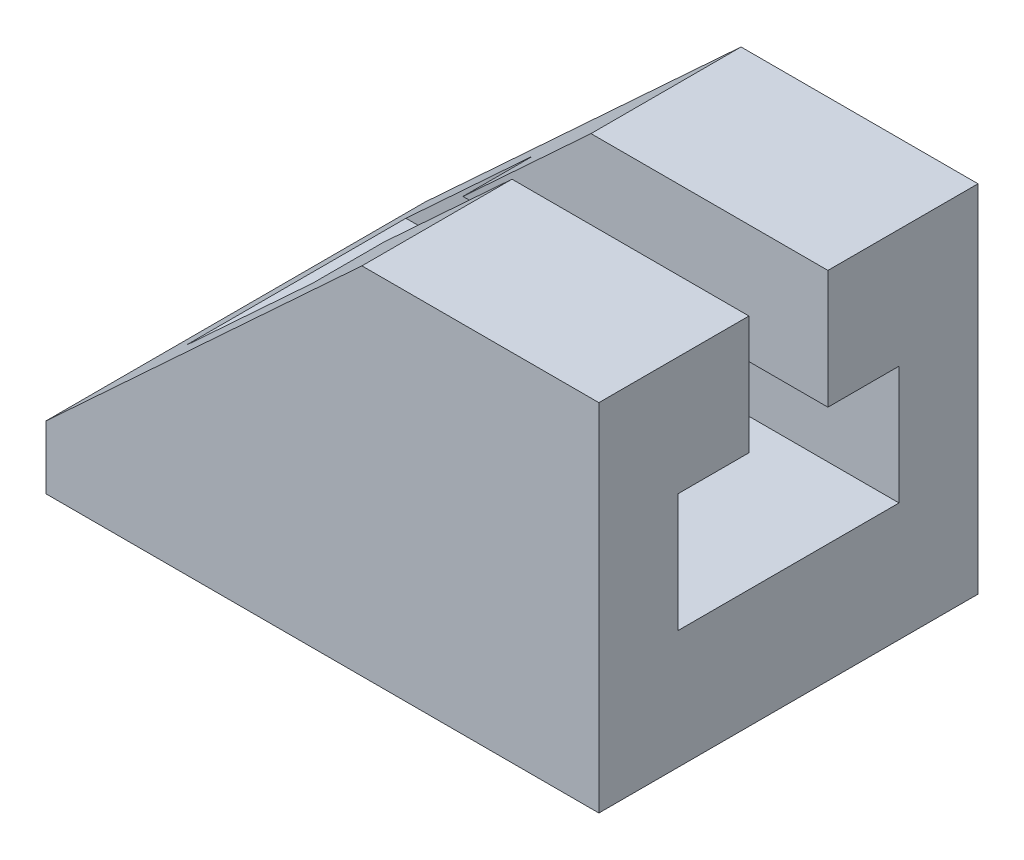
ISO-10303-21;
HEADER;
FILE_DESCRIPTION(('STEP AP214'),'2;1');
FILE_NAME('part.step','',(''),(''),'','','');
FILE_SCHEMA(('AUTOMOTIVE_DESIGN { 1 0 10303 214 1 1 1 1 }'));
ENDSEC;
DATA;
#1=APPLICATION_CONTEXT('core data for automotive mechanical design processes');
#2=APPLICATION_PROTOCOL_DEFINITION('international standard','automotive_design',2000,#1);
#3=PRODUCT_CONTEXT('',#1,'mechanical');
#4=PRODUCT('Part','Part','',(#3));
#5=PRODUCT_RELATED_PRODUCT_CATEGORY('part','',(#4));
#6=PRODUCT_DEFINITION_FORMATION('','',#4);
#7=PRODUCT_DEFINITION_CONTEXT('part definition',#1,'design');
#8=PRODUCT_DEFINITION('design','',#6,#7);
#9=PRODUCT_DEFINITION_SHAPE('','',#8);
#10=(LENGTH_UNIT() NAMED_UNIT(*) SI_UNIT(.MILLI.,.METRE.));
#11=(NAMED_UNIT(*) PLANE_ANGLE_UNIT() SI_UNIT($,.RADIAN.));
#12=(NAMED_UNIT(*) SI_UNIT($,.STERADIAN.) SOLID_ANGLE_UNIT());
#13=UNCERTAINTY_MEASURE_WITH_UNIT(LENGTH_MEASURE(1.E-05),#10,'distance_accuracy_value','');
#14=(GEOMETRIC_REPRESENTATION_CONTEXT(3) GLOBAL_UNCERTAINTY_ASSIGNED_CONTEXT((#13)) GLOBAL_UNIT_ASSIGNED_CONTEXT((#10,
#11,#12)) REPRESENTATION_CONTEXT('',''));
#15=CARTESIAN_POINT('',(0.,0.,0.));
#16=DIRECTION('',(0.,0.,1.));
#17=DIRECTION('',(1.,0.,0.));
#18=AXIS2_PLACEMENT_3D('',#15,#16,#17);
#19=CARTESIAN_POINT('',(-3.69265374531835,10.3057594756554,48.));
#20=DIRECTION('',(0.,-1.,0.));
#21=DIRECTION('',(0.,0.,-1.));
#22=AXIS2_PLACEMENT_3D('',#19,#20,#21);
#23=PLANE('',#22);
#24=DIRECTION('',(0.,0.,-1.));
#25=VECTOR('',#24,1.);
#26=CARTESIAN_POINT('',(-33.6926537453184,10.3057594756554,48.));
#27=LINE('',#26,#25);
#28=CARTESIAN_POINT('',(-33.6926537453184,10.3057594756554,19.));
#29=VERTEX_POINT('',#28);
#30=CARTESIAN_POINT('',(-33.6926537453184,10.3057594756554,0.));
#31=VERTEX_POINT('',#30);
#32=EDGE_CURVE('E158',#29,#31,#27,.T.);
#33=ORIENTED_EDGE('',*,*,#32,.F.);
#34=DIRECTION('',(-1.,0.,0.));
#35=VECTOR('',#34,1.);
#36=CARTESIAN_POINT('',(-3.69265374531835,10.3057594756554,19.));
#37=LINE('',#36,#35);
#38=CARTESIAN_POINT('',(-3.69265374531835,10.3057594756554,19.));
#39=VERTEX_POINT('',#38);
#40=EDGE_CURVE('E142',#39,#29,#37,.T.);
#41=ORIENTED_EDGE('',*,*,#40,.F.);
#42=DIRECTION('',(0.,0.,-1.));
#43=VECTOR('',#42,1.);
#44=CARTESIAN_POINT('',(-3.69265374531835,10.3057594756554,48.));
#45=LINE('',#44,#43);
#46=CARTESIAN_POINT('',(-3.69265374531835,10.3057594756554,0.));
#47=VERTEX_POINT('',#46);
#48=EDGE_CURVE('E125',#39,#47,#45,.T.);
#49=ORIENTED_EDGE('',*,*,#48,.T.);
#50=DIRECTION('',(-1.,0.,0.));
#51=VECTOR('',#50,1.);
#52=CARTESIAN_POINT('',(-3.69265374531835,10.3057594756554,0.));
#53=LINE('',#52,#51);
#54=EDGE_CURVE('E149',#47,#31,#53,.T.);
#55=ORIENTED_EDGE('',*,*,#54,.T.);
#56=EDGE_LOOP('',(#33,#41,#49,#55));
#57=FACE_BOUND('',#56,.T.);
#58=ADVANCED_FACE('F39',(#57),#23,.F.);
#59=CARTESIAN_POINT('',(-73.6926537453184,-34.6942405243446,48.));
#60=DIRECTION('',(1.,0.,0.));
#61=DIRECTION('',(0.,0.,-1.));
#62=AXIS2_PLACEMENT_3D('',#59,#60,#61);
#63=PLANE('',#62);
#64=DIRECTION('',(0.,-1.,0.));
#65=VECTOR('',#64,1.);
#66=CARTESIAN_POINT('',(-73.6926537453184,-34.6942405243446,0.));
#67=LINE('',#66,#65);
#68=CARTESIAN_POINT('',(-73.6926537453184,-26.6942405243446,0.));
#69=VERTEX_POINT('',#68);
#70=CARTESIAN_POINT('',(-73.6926537453184,-34.6942405243446,0.));
#71=VERTEX_POINT('',#70);
#72=EDGE_CURVE('E137',#69,#71,#67,.T.);
#73=ORIENTED_EDGE('',*,*,#72,.T.);
#74=DIRECTION('',(0.,0.,-1.));
#75=VECTOR('',#74,1.);
#76=CARTESIAN_POINT('',(-73.6926537453184,-34.6942405243446,48.));
#77=LINE('',#76,#75);
#78=CARTESIAN_POINT('',(-73.6926537453184,-34.6942405243446,48.));
#79=VERTEX_POINT('',#78);
#80=EDGE_CURVE('E163',#79,#71,#77,.T.);
#81=ORIENTED_EDGE('',*,*,#80,.F.);
#82=DIRECTION('',(0.,-1.,0.));
#83=VECTOR('',#82,1.);
#84=CARTESIAN_POINT('',(-73.6926537453184,-34.6942405243446,48.));
#85=LINE('',#84,#83);
#86=CARTESIAN_POINT('',(-73.6926537453184,-26.6942405243446,48.));
#87=VERTEX_POINT('',#86);
#88=EDGE_CURVE('E155',#87,#79,#85,.T.);
#89=ORIENTED_EDGE('',*,*,#88,.F.);
#90=DIRECTION('',(0.,0.,-1.));
#91=VECTOR('',#90,1.);
#92=CARTESIAN_POINT('',(-73.6926537453184,-26.6942405243446,48.));
#93=LINE('',#92,#91);
#94=EDGE_CURVE('E133',#87,#69,#93,.T.);
#95=ORIENTED_EDGE('',*,*,#94,.T.);
#96=EDGE_LOOP('',(#73,#81,#89,#95));
#97=FACE_BOUND('',#96,.T.);
#98=ADVANCED_FACE('F41',(#97),#63,.F.);
#99=CARTESIAN_POINT('',(-73.6926537453184,-34.6942405243446,48.));
#100=DIRECTION('',(0.,1.,0.));
#101=DIRECTION('',(0.,0.,1.));
#102=AXIS2_PLACEMENT_3D('',#99,#100,#101);
#103=PLANE('',#102);
#104=DIRECTION('',(1.,0.,0.));
#105=VECTOR('',#104,1.);
#106=CARTESIAN_POINT('',(-73.6926537453184,-34.6942405243446,0.));
#107=LINE('',#106,#105);
#108=CARTESIAN_POINT('',(-3.69265374531835,-34.6942405243446,0.));
#109=VERTEX_POINT('',#108);
#110=EDGE_CURVE('E141',#71,#109,#107,.T.);
#111=ORIENTED_EDGE('',*,*,#110,.T.);
#112=DIRECTION('',(0.,0.,-1.));
#113=VECTOR('',#112,1.);
#114=CARTESIAN_POINT('',(-3.69265374531835,-34.6942405243446,48.));
#115=LINE('',#114,#113);
#116=CARTESIAN_POINT('',(-3.69265374531835,-34.6942405243446,48.));
#117=VERTEX_POINT('',#116);
#118=EDGE_CURVE('E124',#117,#109,#115,.T.);
#119=ORIENTED_EDGE('',*,*,#118,.F.);
#120=DIRECTION('',(1.,0.,0.));
#121=VECTOR('',#120,1.);
#122=CARTESIAN_POINT('',(-73.6926537453184,-34.6942405243446,48.));
#123=LINE('',#122,#121);
#124=EDGE_CURVE('E96',#79,#117,#123,.T.);
#125=ORIENTED_EDGE('',*,*,#124,.F.);
#126=ORIENTED_EDGE('',*,*,#80,.T.);
#127=EDGE_LOOP('',(#111,#119,#125,#126));
#128=FACE_BOUND('',#127,.T.);
#129=ADVANCED_FACE('F234',(#128),#103,.F.);
#130=CARTESIAN_POINT('',(-3.69265374531835,-34.6942405243446,48.));
#131=DIRECTION('',(-1.,0.,0.));
#132=DIRECTION('',(0.,0.,1.));
#133=AXIS2_PLACEMENT_3D('',#130,#131,#132);
#134=PLANE('',#133);
#135=ORIENTED_EDGE('',*,*,#48,.F.);
#136=DIRECTION('',(0.,-1.,0.));
#137=VECTOR('',#136,1.);
#138=CARTESIAN_POINT('',(-3.69265374531835,10.3057594756554,19.));
#139=LINE('',#138,#137);
#140=CARTESIAN_POINT('',(-3.69265374531835,-4.69424052434457,19.));
#141=VERTEX_POINT('',#140);
#142=EDGE_CURVE('E250',#39,#141,#139,.T.);
#143=ORIENTED_EDGE('',*,*,#142,.T.);
#144=DIRECTION('',(0.,0.,-1.));
#145=VECTOR('',#144,1.);
#146=CARTESIAN_POINT('',(-3.69265374531835,-4.69424052434457,19.));
#147=LINE('',#146,#145);
#148=CARTESIAN_POINT('',(-3.69265374531835,-4.69424052434457,10.));
#149=VERTEX_POINT('',#148);
#150=EDGE_CURVE('E255',#141,#149,#147,.T.);
#151=ORIENTED_EDGE('',*,*,#150,.T.);
#152=DIRECTION('',(0.,-1.,0.));
#153=VECTOR('',#152,1.);
#154=CARTESIAN_POINT('',(-3.69265374531835,-4.69424052434457,10.));
#155=LINE('',#154,#153);
#156=CARTESIAN_POINT('',(-3.69265374531835,-19.6942405243446,10.));
#157=VERTEX_POINT('',#156);
#158=EDGE_CURVE('E258',#149,#157,#155,.T.);
#159=ORIENTED_EDGE('',*,*,#158,.T.);
#160=DIRECTION('',(0.,0.,1.));
#161=VECTOR('',#160,1.);
#162=CARTESIAN_POINT('',(-3.69265374531835,-19.6942405243446,10.));
#163=LINE('',#162,#161);
#164=CARTESIAN_POINT('',(-3.69265374531835,-19.6942405243446,38.));
#165=VERTEX_POINT('',#164);
#166=EDGE_CURVE('E264',#157,#165,#163,.T.);
#167=ORIENTED_EDGE('',*,*,#166,.T.);
#168=DIRECTION('',(0.,1.,0.));
#169=VECTOR('',#168,1.);
#170=CARTESIAN_POINT('',(-3.69265374531835,-19.6942405243446,38.));
#171=LINE('',#170,#169);
#172=CARTESIAN_POINT('',(-3.69265374531835,-4.69424052434457,38.));
#173=VERTEX_POINT('',#172);
#174=EDGE_CURVE('E268',#165,#173,#171,.T.);
#175=ORIENTED_EDGE('',*,*,#174,.T.);
#176=DIRECTION('',(0.,0.,-1.));
#177=VECTOR('',#176,1.);
#178=CARTESIAN_POINT('',(-3.69265374531835,-4.69424052434457,38.));
#179=LINE('',#178,#177);
#180=CARTESIAN_POINT('',(-3.69265374531835,-4.69424052434457,29.));
#181=VERTEX_POINT('',#180);
#182=EDGE_CURVE('E272',#173,#181,#179,.T.);
#183=ORIENTED_EDGE('',*,*,#182,.T.);
#184=DIRECTION('',(0.,1.,0.));
#185=VECTOR('',#184,1.);
#186=CARTESIAN_POINT('',(-3.69265374531835,10.3057594756554,29.));
#187=LINE('',#186,#185);
#188=CARTESIAN_POINT('',(-3.69265374531835,10.3057594756554,29.));
#189=VERTEX_POINT('',#188);
#190=EDGE_CURVE('E120',#181,#189,#187,.T.);
#191=ORIENTED_EDGE('',*,*,#190,.T.);
#192=CARTESIAN_POINT('',(-3.69265374531835,10.3057594756554,48.));
#193=VERTEX_POINT('',#192);
#194=EDGE_CURVE('E114',#193,#189,#45,.T.);
#195=ORIENTED_EDGE('',*,*,#194,.F.);
#196=DIRECTION('',(0.,1.,0.));
#197=VECTOR('',#196,1.);
#198=CARTESIAN_POINT('',(-3.69265374531835,-34.6942405243446,48.));
#199=LINE('',#198,#197);
#200=EDGE_CURVE('E102',#117,#193,#199,.T.);
#201=ORIENTED_EDGE('',*,*,#200,.F.);
#202=ORIENTED_EDGE('',*,*,#118,.T.);
#203=DIRECTION('',(0.,1.,0.));
#204=VECTOR('',#203,1.);
#205=CARTESIAN_POINT('',(-3.69265374531835,-34.6942405243446,0.));
#206=LINE('',#205,#204);
#207=EDGE_CURVE('E145',#109,#47,#206,.T.);
#208=ORIENTED_EDGE('',*,*,#207,.T.);
#209=EDGE_LOOP('',(#135,#143,#151,#159,#167,#175,#183,#191,#195,#201,#202,#208));
#210=FACE_BOUND('',#209,.T.);
#211=ADVANCED_FACE('F116',(#210),#134,.F.);
#212=ORIENTED_EDGE('',*,*,#194,.T.);
#213=DIRECTION('',(-1.,0.,0.));
#214=VECTOR('',#213,1.);
#215=CARTESIAN_POINT('',(-3.69265374531835,10.3057594756554,29.));
#216=LINE('',#215,#214);
#217=CARTESIAN_POINT('',(-33.6926537453183,10.3057594756554,29.));
#218=VERTEX_POINT('',#217);
#219=EDGE_CURVE('E198',#189,#218,#216,.T.);
#220=ORIENTED_EDGE('',*,*,#219,.T.);
#221=CARTESIAN_POINT('',(-33.6926537453184,10.3057594756554,48.));
#222=VERTEX_POINT('',#221);
#223=EDGE_CURVE('E129',#222,#218,#27,.T.);
#224=ORIENTED_EDGE('',*,*,#223,.F.);
#225=DIRECTION('',(-1.,0.,0.));
#226=VECTOR('',#225,1.);
#227=CARTESIAN_POINT('',(-3.69265374531835,10.3057594756554,48.));
#228=LINE('',#227,#226);
#229=EDGE_CURVE('E106',#193,#222,#228,.T.);
#230=ORIENTED_EDGE('',*,*,#229,.F.);
#231=EDGE_LOOP('',(#212,#220,#224,#230));
#232=FACE_BOUND('',#231,.T.);
#233=ADVANCED_FACE('F127',(#232),#23,.F.);
#234=CARTESIAN_POINT('',(-73.6926537453184,-26.6942405243446,48.));
#235=DIRECTION('',(0.679041981617427,-0.734099439586408,0.));
#236=DIRECTION('',(0.734099439586408,0.679041981617427,0.));
#237=AXIS2_PLACEMENT_3D('',#234,#235,#236);
#238=PLANE('',#237);
#239=DIRECTION('',(0.,0.,1.));
#240=VECTOR('',#239,1.);
#241=CARTESIAN_POINT('',(-49.9088699615346,-4.69424052434457,48.));
#242=LINE('',#241,#240);
#243=CARTESIAN_POINT('',(-49.9088699615346,-4.69424052434457,10.));
#244=VERTEX_POINT('',#243);
#245=CARTESIAN_POINT('',(-49.9088699615346,-4.69424052434457,19.));
#246=VERTEX_POINT('',#245);
#247=EDGE_CURVE('E166',#244,#246,#242,.T.);
#248=ORIENTED_EDGE('',*,*,#247,.T.);
#249=DIRECTION('',(0.734099439586408,0.679041981617427,0.));
#250=VECTOR('',#249,1.);
#251=CARTESIAN_POINT('',(-73.6926537453184,-26.6942405243446,19.));
#252=LINE('',#251,#250);
#253=EDGE_CURVE('E11',#246,#29,#252,.T.);
#254=ORIENTED_EDGE('',*,*,#253,.T.);
#255=ORIENTED_EDGE('',*,*,#32,.T.);
#256=DIRECTION('',(-0.734099439586408,-0.679041981617427,0.));
#257=VECTOR('',#256,1.);
#258=CARTESIAN_POINT('',(-73.6926537453184,-26.6942405243446,0.));
#259=LINE('',#258,#257);
#260=EDGE_CURVE('E87',#31,#69,#259,.T.);
#261=ORIENTED_EDGE('',*,*,#260,.T.);
#262=ORIENTED_EDGE('',*,*,#94,.F.);
#263=DIRECTION('',(-0.734099439586408,-0.679041981617427,0.));
#264=VECTOR('',#263,1.);
#265=CARTESIAN_POINT('',(-73.6926537453184,-26.6942405243446,48.));
#266=LINE('',#265,#264);
#267=EDGE_CURVE('E64',#222,#87,#266,.T.);
#268=ORIENTED_EDGE('',*,*,#267,.F.);
#269=ORIENTED_EDGE('',*,*,#223,.T.);
#270=DIRECTION('',(-0.734099439586408,-0.679041981617427,0.));
#271=VECTOR('',#270,1.);
#272=CARTESIAN_POINT('',(-73.6926537453184,-26.6942405243446,29.));
#273=LINE('',#272,#271);
#274=CARTESIAN_POINT('',(-49.9088699615346,-4.69424052434457,29.));
#275=VERTEX_POINT('',#274);
#276=EDGE_CURVE('E48',#218,#275,#273,.T.);
#277=ORIENTED_EDGE('',*,*,#276,.T.);
#278=DIRECTION('',(0.,0.,1.));
#279=VECTOR('',#278,1.);
#280=CARTESIAN_POINT('',(-49.9088699615346,-4.69424052434457,48.));
#281=LINE('',#280,#279);
#282=CARTESIAN_POINT('',(-49.9088699615346,-4.69424052434457,38.));
#283=VERTEX_POINT('',#282);
#284=EDGE_CURVE('E182',#275,#283,#281,.T.);
#285=ORIENTED_EDGE('',*,*,#284,.T.);
#286=DIRECTION('',(-0.734099439586408,-0.679041981617427,0.));
#287=VECTOR('',#286,1.);
#288=CARTESIAN_POINT('',(-73.6926537453184,-26.6942405243446,38.));
#289=LINE('',#288,#287);
#290=CARTESIAN_POINT('',(-66.1250861777508,-19.6942405243446,38.));
#291=VERTEX_POINT('',#290);
#292=EDGE_CURVE('E178',#283,#291,#289,.T.);
#293=ORIENTED_EDGE('',*,*,#292,.T.);
#294=DIRECTION('',(0.,0.,-1.));
#295=VECTOR('',#294,1.);
#296=CARTESIAN_POINT('',(-66.1250861777508,-19.6942405243446,48.));
#297=LINE('',#296,#295);
#298=CARTESIAN_POINT('',(-66.1250861777508,-19.6942405243446,10.));
#299=VERTEX_POINT('',#298);
#300=EDGE_CURVE('E174',#291,#299,#297,.T.);
#301=ORIENTED_EDGE('',*,*,#300,.T.);
#302=DIRECTION('',(0.734099439586408,0.679041981617427,0.));
#303=VECTOR('',#302,1.);
#304=CARTESIAN_POINT('',(-73.6926537453184,-26.6942405243446,10.));
#305=LINE('',#304,#303);
#306=EDGE_CURVE('E170',#299,#244,#305,.T.);
#307=ORIENTED_EDGE('',*,*,#306,.T.);
#308=EDGE_LOOP('',(#248,#254,#255,#261,#262,#268,#269,#277,#285,#293,#301,#307));
#309=FACE_BOUND('',#308,.T.);
#310=ADVANCED_FACE('F189',(#309),#238,.F.);
#311=CARTESIAN_POINT('',(0.,0.,48.));
#312=DIRECTION('',(0.,0.,1.));
#313=DIRECTION('',(1.,0.,0.));
#314=AXIS2_PLACEMENT_3D('',#311,#312,#313);
#315=PLANE('',#314);
#316=ORIENTED_EDGE('',*,*,#88,.T.);
#317=ORIENTED_EDGE('',*,*,#124,.T.);
#318=ORIENTED_EDGE('',*,*,#200,.T.);
#319=ORIENTED_EDGE('',*,*,#229,.T.);
#320=ORIENTED_EDGE('',*,*,#267,.T.);
#321=EDGE_LOOP('',(#316,#317,#318,#319,#320));
#322=FACE_BOUND('',#321,.T.);
#323=ADVANCED_FACE('F104',(#322),#315,.T.);
#324=CARTESIAN_POINT('',(0.,0.,0.));
#325=DIRECTION('',(0.,0.,1.));
#326=DIRECTION('',(1.,0.,0.));
#327=AXIS2_PLACEMENT_3D('',#324,#325,#326);
#328=PLANE('',#327);
#329=ORIENTED_EDGE('',*,*,#72,.F.);
#330=ORIENTED_EDGE('',*,*,#260,.F.);
#331=ORIENTED_EDGE('',*,*,#54,.F.);
#332=ORIENTED_EDGE('',*,*,#207,.F.);
#333=ORIENTED_EDGE('',*,*,#110,.F.);
#334=EDGE_LOOP('',(#329,#330,#331,#332,#333));
#335=FACE_BOUND('',#334,.T.);
#336=ADVANCED_FACE('F238',(#335),#328,.F.);
#337=CARTESIAN_POINT('',(-3.69265374531835,10.3057594756554,19.));
#338=DIRECTION('',(0.,0.,-1.));
#339=DIRECTION('',(0.,1.,0.));
#340=AXIS2_PLACEMENT_3D('',#337,#338,#339);
#341=PLANE('',#340);
#342=DIRECTION('',(-1.,0.,0.));
#343=VECTOR('',#342,1.);
#344=CARTESIAN_POINT('',(-3.69265374531835,-4.69424052434457,19.));
#345=LINE('',#344,#343);
#346=EDGE_CURVE('E55',#141,#246,#345,.T.);
#347=ORIENTED_EDGE('',*,*,#346,.F.);
#348=ORIENTED_EDGE('',*,*,#142,.F.);
#349=ORIENTED_EDGE('',*,*,#40,.T.);
#350=ORIENTED_EDGE('',*,*,#253,.F.);
#351=EDGE_LOOP('',(#347,#348,#349,#350));
#352=FACE_BOUND('',#351,.T.);
#353=ADVANCED_FACE('F247',(#352),#341,.F.);
#354=CARTESIAN_POINT('',(-3.69265374531835,10.3057594756554,29.));
#355=DIRECTION('',(0.,0.,1.));
#356=DIRECTION('',(0.,-1.,0.));
#357=AXIS2_PLACEMENT_3D('',#354,#355,#356);
#358=PLANE('',#357);
#359=ORIENTED_EDGE('',*,*,#219,.F.);
#360=ORIENTED_EDGE('',*,*,#190,.F.);
#361=DIRECTION('',(-1.,0.,0.));
#362=VECTOR('',#361,1.);
#363=CARTESIAN_POINT('',(-3.69265374531835,-4.69424052434457,29.));
#364=LINE('',#363,#362);
#365=EDGE_CURVE('E200',#181,#275,#364,.T.);
#366=ORIENTED_EDGE('',*,*,#365,.T.);
#367=ORIENTED_EDGE('',*,*,#276,.F.);
#368=EDGE_LOOP('',(#359,#360,#366,#367));
#369=FACE_BOUND('',#368,.T.);
#370=ADVANCED_FACE('F197',(#369),#358,.F.);
#371=CARTESIAN_POINT('',(-3.69265374531835,-4.69424052434457,38.));
#372=DIRECTION('',(0.,1.,0.));
#373=DIRECTION('',(0.,0.,1.));
#374=AXIS2_PLACEMENT_3D('',#371,#372,#373);
#375=PLANE('',#374);
#376=ORIENTED_EDGE('',*,*,#365,.F.);
#377=ORIENTED_EDGE('',*,*,#182,.F.);
#378=DIRECTION('',(-1.,0.,0.));
#379=VECTOR('',#378,1.);
#380=CARTESIAN_POINT('',(-3.69265374531835,-4.69424052434457,38.));
#381=LINE('',#380,#379);
#382=EDGE_CURVE('E207',#173,#283,#381,.T.);
#383=ORIENTED_EDGE('',*,*,#382,.T.);
#384=ORIENTED_EDGE('',*,*,#284,.F.);
#385=EDGE_LOOP('',(#376,#377,#383,#384));
#386=FACE_BOUND('',#385,.T.);
#387=ADVANCED_FACE('F281',(#386),#375,.F.);
#388=CARTESIAN_POINT('',(-3.69265374531835,-19.6942405243446,38.));
#389=DIRECTION('',(0.,0.,1.));
#390=DIRECTION('',(1.,0.,0.));
#391=AXIS2_PLACEMENT_3D('',#388,#389,#390);
#392=PLANE('',#391);
#393=ORIENTED_EDGE('',*,*,#382,.F.);
#394=ORIENTED_EDGE('',*,*,#174,.F.);
#395=DIRECTION('',(-1.,0.,0.));
#396=VECTOR('',#395,1.);
#397=CARTESIAN_POINT('',(-3.69265374531835,-19.6942405243446,38.));
#398=LINE('',#397,#396);
#399=EDGE_CURVE('E214',#165,#291,#398,.T.);
#400=ORIENTED_EDGE('',*,*,#399,.T.);
#401=ORIENTED_EDGE('',*,*,#292,.F.);
#402=EDGE_LOOP('',(#393,#394,#400,#401));
#403=FACE_BOUND('',#402,.T.);
#404=ADVANCED_FACE('F300',(#403),#392,.F.);
#405=CARTESIAN_POINT('',(-3.69265374531835,-19.6942405243446,10.));
#406=DIRECTION('',(0.,-1.,0.));
#407=DIRECTION('',(0.,0.,-1.));
#408=AXIS2_PLACEMENT_3D('',#405,#406,#407);
#409=PLANE('',#408);
#410=ORIENTED_EDGE('',*,*,#399,.F.);
#411=ORIENTED_EDGE('',*,*,#166,.F.);
#412=DIRECTION('',(-1.,0.,0.));
#413=VECTOR('',#412,1.);
#414=CARTESIAN_POINT('',(-3.69265374531835,-19.6942405243446,10.));
#415=LINE('',#414,#413);
#416=EDGE_CURVE('E218',#157,#299,#415,.T.);
#417=ORIENTED_EDGE('',*,*,#416,.T.);
#418=ORIENTED_EDGE('',*,*,#300,.F.);
#419=EDGE_LOOP('',(#410,#411,#417,#418));
#420=FACE_BOUND('',#419,.T.);
#421=ADVANCED_FACE('F302',(#420),#409,.F.);
#422=CARTESIAN_POINT('',(-3.69265374531835,-4.69424052434457,10.));
#423=DIRECTION('',(0.,0.,-1.));
#424=DIRECTION('',(-1.,0.,0.));
#425=AXIS2_PLACEMENT_3D('',#422,#423,#424);
#426=PLANE('',#425);
#427=ORIENTED_EDGE('',*,*,#416,.F.);
#428=ORIENTED_EDGE('',*,*,#158,.F.);
#429=DIRECTION('',(-1.,0.,0.));
#430=VECTOR('',#429,1.);
#431=CARTESIAN_POINT('',(-3.69265374531835,-4.69424052434457,10.));
#432=LINE('',#431,#430);
#433=EDGE_CURVE('E222',#149,#244,#432,.T.);
#434=ORIENTED_EDGE('',*,*,#433,.T.);
#435=ORIENTED_EDGE('',*,*,#306,.F.);
#436=EDGE_LOOP('',(#427,#428,#434,#435));
#437=FACE_BOUND('',#436,.T.);
#438=ADVANCED_FACE('F307',(#437),#426,.F.);
#439=CARTESIAN_POINT('',(-3.69265374531835,-4.69424052434457,19.));
#440=DIRECTION('',(0.,1.,0.));
#441=DIRECTION('',(0.,0.,1.));
#442=AXIS2_PLACEMENT_3D('',#439,#440,#441);
#443=PLANE('',#442);
#444=ORIENTED_EDGE('',*,*,#433,.F.);
#445=ORIENTED_EDGE('',*,*,#150,.F.);
#446=ORIENTED_EDGE('',*,*,#346,.T.);
#447=ORIENTED_EDGE('',*,*,#247,.F.);
#448=EDGE_LOOP('',(#444,#445,#446,#447));
#449=FACE_BOUND('',#448,.T.);
#450=ADVANCED_FACE('F312',(#449),#443,.F.);
#451=CLOSED_SHELL('',(#58,#98,#129,#211,#233,#310,#323,#336,#353,#370,#387,#404,#421,#438,#450));
#452=MANIFOLD_SOLID_BREP('B2',#451);
#453=ADVANCED_BREP_SHAPE_REPRESENTATION('',(#18,#452),#14);
#454=SHAPE_DEFINITION_REPRESENTATION(#9,#453);
ENDSEC;
END-ISO-10303-21;
